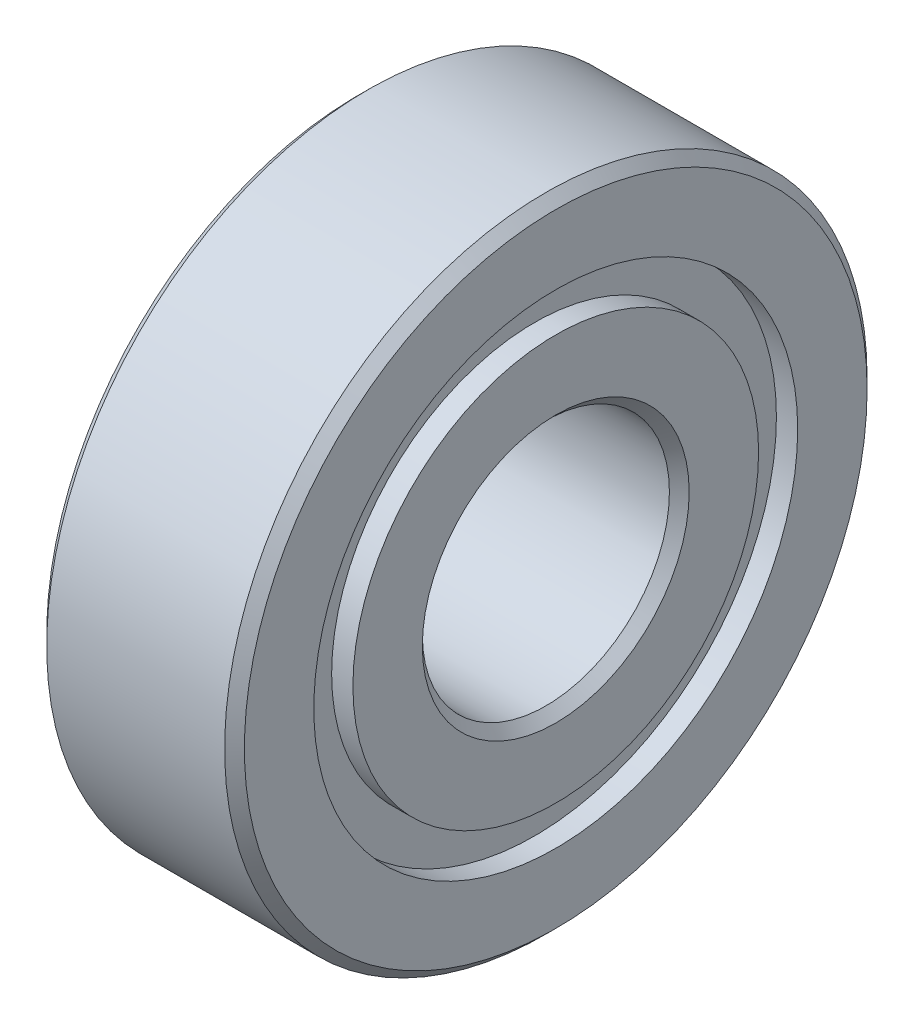
ISO-10303-21;
HEADER;
FILE_DESCRIPTION(('STEP AP214'),'2;1');
FILE_NAME('part.step','',(''),(''),'','','');
FILE_SCHEMA(('AUTOMOTIVE_DESIGN { 1 0 10303 214 1 1 1 1 }'));
ENDSEC;
DATA;
#1=APPLICATION_CONTEXT('core data for automotive mechanical design processes');
#2=APPLICATION_PROTOCOL_DEFINITION('international standard','automotive_design',2000,#1);
#3=PRODUCT_CONTEXT('',#1,'mechanical');
#4=PRODUCT('Part','Part','',(#3));
#5=PRODUCT_RELATED_PRODUCT_CATEGORY('part','',(#4));
#6=PRODUCT_DEFINITION_FORMATION('','',#4);
#7=PRODUCT_DEFINITION_CONTEXT('part definition',#1,'design');
#8=PRODUCT_DEFINITION('design','',#6,#7);
#9=PRODUCT_DEFINITION_SHAPE('','',#8);
#10=(LENGTH_UNIT() NAMED_UNIT(*) SI_UNIT(.MILLI.,.METRE.));
#11=(NAMED_UNIT(*) PLANE_ANGLE_UNIT() SI_UNIT($,.RADIAN.));
#12=(NAMED_UNIT(*) SI_UNIT($,.STERADIAN.) SOLID_ANGLE_UNIT());
#13=UNCERTAINTY_MEASURE_WITH_UNIT(LENGTH_MEASURE(1.E-05),#10,'distance_accuracy_value','');
#14=(GEOMETRIC_REPRESENTATION_CONTEXT(3) GLOBAL_UNCERTAINTY_ASSIGNED_CONTEXT((#13)) GLOBAL_UNIT_ASSIGNED_CONTEXT((#10,
#11,#12)) REPRESENTATION_CONTEXT('',''));
#15=CARTESIAN_POINT('',(0.,0.,0.));
#16=DIRECTION('',(0.,0.,1.));
#17=DIRECTION('',(1.,0.,0.));
#18=AXIS2_PLACEMENT_3D('',#15,#16,#17);
#19=CARTESIAN_POINT('',(4.,9.79120879120879,0.));
#20=DIRECTION('',(1.,0.,0.));
#21=DIRECTION('',(0.,0.,-1.));
#22=AXIS2_PLACEMENT_3D('',#19,#20,#21);
#23=PLANE('',#22);
#24=CARTESIAN_POINT('',(4.,0.,0.));
#25=DIRECTION('',(1.,0.,0.));
#26=DIRECTION('',(0.,0.,-1.));
#27=AXIS2_PLACEMENT_3D('',#24,#25,#26);
#28=CIRCLE('',#27,12.6);
#29=CARTESIAN_POINT('',(4.,0.,-12.6));
#30=VERTEX_POINT('',#29);
#31=EDGE_CURVE('E10',#30,#30,#28,.T.);
#32=ORIENTED_EDGE('',*,*,#31,.T.);
#33=EDGE_LOOP('',(#32));
#34=FACE_BOUND('',#33,.T.);
#35=CARTESIAN_POINT('',(4.,0.,0.));
#36=DIRECTION('',(1.,0.,0.));
#37=DIRECTION('',(0.,0.,-1.));
#38=AXIS2_PLACEMENT_3D('',#35,#36,#37);
#39=CIRCLE('',#38,9.79120879120879);
#40=CARTESIAN_POINT('',(4.,0.,-9.79120879120879));
#41=VERTEX_POINT('',#40);
#42=EDGE_CURVE('E88',#41,#41,#39,.T.);
#43=ORIENTED_EDGE('',*,*,#42,.F.);
#44=EDGE_LOOP('',(#43));
#45=FACE_BOUND('',#44,.T.);
#46=ADVANCED_FACE('F36',(#34,#45),#23,.T.);
#47=CARTESIAN_POINT('',(4.,0.,0.));
#48=DIRECTION('',(-1.,0.,0.));
#49=DIRECTION('',(0.,0.,1.));
#50=AXIS2_PLACEMENT_3D('',#47,#48,#49);
#51=CONICAL_SURFACE('',#50,12.6,0.78539816339745);
#52=CARTESIAN_POINT('',(3.6,0.,0.));
#53=DIRECTION('',(1.,0.,0.));
#54=DIRECTION('',(0.,0.,-1.));
#55=AXIS2_PLACEMENT_3D('',#52,#53,#54);
#56=CIRCLE('',#55,13.);
#57=CARTESIAN_POINT('',(3.6,0.,-13.));
#58=VERTEX_POINT('',#57);
#59=EDGE_CURVE('E42',#58,#58,#56,.T.);
#60=ORIENTED_EDGE('',*,*,#59,.T.);
#61=EDGE_LOOP('',(#60));
#62=FACE_BOUND('',#61,.T.);
#63=ORIENTED_EDGE('',*,*,#31,.F.);
#64=EDGE_LOOP('',(#63));
#65=FACE_BOUND('',#64,.T.);
#66=ADVANCED_FACE('F96',(#62,#65),#51,.T.);
#67=CARTESIAN_POINT('',(-4.,0.,0.));
#68=DIRECTION('',(1.,0.,0.));
#69=DIRECTION('',(0.,0.,-1.));
#70=AXIS2_PLACEMENT_3D('',#67,#68,#69);
#71=CYLINDRICAL_SURFACE('',#70,13.);
#72=CARTESIAN_POINT('',(-3.6,0.,0.));
#73=DIRECTION('',(1.,0.,0.));
#74=DIRECTION('',(0.,0.,-1.));
#75=AXIS2_PLACEMENT_3D('',#72,#73,#74);
#76=CIRCLE('',#75,13.);
#77=CARTESIAN_POINT('',(-3.6,0.,-13.));
#78=VERTEX_POINT('',#77);
#79=EDGE_CURVE('E46',#78,#78,#76,.T.);
#80=ORIENTED_EDGE('',*,*,#79,.T.);
#81=EDGE_LOOP('',(#80));
#82=FACE_BOUND('',#81,.T.);
#83=ORIENTED_EDGE('',*,*,#59,.F.);
#84=EDGE_LOOP('',(#83));
#85=FACE_BOUND('',#84,.T.);
#86=ADVANCED_FACE('F100',(#82,#85),#71,.T.);
#87=CARTESIAN_POINT('',(-3.6,0.,0.));
#88=DIRECTION('',(1.,0.,0.));
#89=DIRECTION('',(0.,0.,-1.));
#90=AXIS2_PLACEMENT_3D('',#87,#88,#89);
#91=CONICAL_SURFACE('',#90,13.,0.785398163397448);
#92=CARTESIAN_POINT('',(-4.,0.,0.));
#93=DIRECTION('',(1.,0.,0.));
#94=DIRECTION('',(0.,0.,-1.));
#95=AXIS2_PLACEMENT_3D('',#92,#93,#94);
#96=CIRCLE('',#95,12.6);
#97=CARTESIAN_POINT('',(-4.,0.,-12.6));
#98=VERTEX_POINT('',#97);
#99=EDGE_CURVE('E50',#98,#98,#96,.T.);
#100=ORIENTED_EDGE('',*,*,#99,.T.);
#101=EDGE_LOOP('',(#100));
#102=FACE_BOUND('',#101,.T.);
#103=ORIENTED_EDGE('',*,*,#79,.F.);
#104=EDGE_LOOP('',(#103));
#105=FACE_BOUND('',#104,.T.);
#106=ADVANCED_FACE('F104',(#102,#105),#91,.T.);
#107=CARTESIAN_POINT('',(-4.,12.6,0.));
#108=DIRECTION('',(-1.,0.,0.));
#109=DIRECTION('',(0.,0.,1.));
#110=AXIS2_PLACEMENT_3D('',#107,#108,#109);
#111=PLANE('',#110);
#112=CARTESIAN_POINT('',(-4.,0.,0.));
#113=DIRECTION('',(1.,0.,0.));
#114=DIRECTION('',(0.,0.,-1.));
#115=AXIS2_PLACEMENT_3D('',#112,#113,#114);
#116=CIRCLE('',#115,9.79120879120879);
#117=CARTESIAN_POINT('',(-4.,0.,-9.79120879120879));
#118=VERTEX_POINT('',#117);
#119=EDGE_CURVE('E55',#118,#118,#116,.T.);
#120=ORIENTED_EDGE('',*,*,#119,.T.);
#121=EDGE_LOOP('',(#120));
#122=FACE_BOUND('',#121,.T.);
#123=ORIENTED_EDGE('',*,*,#99,.F.);
#124=EDGE_LOOP('',(#123));
#125=FACE_BOUND('',#124,.T.);
#126=ADVANCED_FACE('F111',(#122,#125),#111,.T.);
#127=CARTESIAN_POINT('',(-4.,0.,0.));
#128=DIRECTION('',(1.,0.,0.));
#129=DIRECTION('',(0.,0.,-1.));
#130=AXIS2_PLACEMENT_3D('',#127,#128,#129);
#131=CYLINDRICAL_SURFACE('',#130,9.79120879120879);
#132=CARTESIAN_POINT('',(-3.13888889,0.,0.));
#133=DIRECTION('',(1.,0.,0.));
#134=DIRECTION('',(0.,0.,-1.));
#135=AXIS2_PLACEMENT_3D('',#132,#133,#134);
#136=CIRCLE('',#135,9.79120879120879);
#137=CARTESIAN_POINT('',(-3.13888889,0.,-9.79120879120879));
#138=VERTEX_POINT('',#137);
#139=EDGE_CURVE('E58',#138,#138,#136,.T.);
#140=ORIENTED_EDGE('',*,*,#139,.T.);
#141=EDGE_LOOP('',(#140));
#142=FACE_BOUND('',#141,.T.);
#143=ORIENTED_EDGE('',*,*,#119,.F.);
#144=EDGE_LOOP('',(#143));
#145=FACE_BOUND('',#144,.T.);
#146=ADVANCED_FACE('F115',(#142,#145),#131,.F.);
#147=CARTESIAN_POINT('',(-3.13888889,9.79120879120879,0.));
#148=DIRECTION('',(-1.,0.,0.));
#149=DIRECTION('',(0.,0.,1.));
#150=AXIS2_PLACEMENT_3D('',#147,#148,#149);
#151=PLANE('',#150);
#152=CARTESIAN_POINT('',(-3.13888889,0.,0.));
#153=DIRECTION('',(1.,0.,0.));
#154=DIRECTION('',(0.,0.,-1.));
#155=AXIS2_PLACEMENT_3D('',#152,#153,#154);
#156=CIRCLE('',#155,8.20879120879121);
#157=CARTESIAN_POINT('',(-3.13888889,0.,-8.20879120879121));
#158=VERTEX_POINT('',#157);
#159=EDGE_CURVE('E61',#158,#158,#156,.T.);
#160=ORIENTED_EDGE('',*,*,#159,.T.);
#161=EDGE_LOOP('',(#160));
#162=FACE_BOUND('',#161,.T.);
#163=ORIENTED_EDGE('',*,*,#139,.F.);
#164=EDGE_LOOP('',(#163));
#165=FACE_BOUND('',#164,.T.);
#166=ADVANCED_FACE('F119',(#162,#165),#151,.T.);
#167=CARTESIAN_POINT('',(-4.,0.,0.));
#168=DIRECTION('',(1.,0.,0.));
#169=DIRECTION('',(0.,0.,-1.));
#170=AXIS2_PLACEMENT_3D('',#167,#168,#169);
#171=CYLINDRICAL_SURFACE('',#170,8.20879120879121);
#172=CARTESIAN_POINT('',(-4.,0.,0.));
#173=DIRECTION('',(1.,0.,0.));
#174=DIRECTION('',(0.,0.,-1.));
#175=AXIS2_PLACEMENT_3D('',#172,#173,#174);
#176=CIRCLE('',#175,8.20879120879121);
#177=CARTESIAN_POINT('',(-4.,0.,-8.20879120879121));
#178=VERTEX_POINT('',#177);
#179=EDGE_CURVE('E64',#178,#178,#176,.T.);
#180=ORIENTED_EDGE('',*,*,#179,.T.);
#181=EDGE_LOOP('',(#180));
#182=FACE_BOUND('',#181,.T.);
#183=ORIENTED_EDGE('',*,*,#159,.F.);
#184=EDGE_LOOP('',(#183));
#185=FACE_BOUND('',#184,.T.);
#186=ADVANCED_FACE('F123',(#182,#185),#171,.T.);
#187=CARTESIAN_POINT('',(-4.,8.20879120879121,0.));
#188=DIRECTION('',(-1.,0.,0.));
#189=DIRECTION('',(0.,0.,1.));
#190=AXIS2_PLACEMENT_3D('',#187,#188,#189);
#191=PLANE('',#190);
#192=CARTESIAN_POINT('',(-4.,0.,0.));
#193=DIRECTION('',(1.,0.,0.));
#194=DIRECTION('',(0.,0.,-1.));
#195=AXIS2_PLACEMENT_3D('',#192,#193,#194);
#196=CIRCLE('',#195,5.40000000000001);
#197=CARTESIAN_POINT('',(-4.,0.,-5.40000000000001));
#198=VERTEX_POINT('',#197);
#199=EDGE_CURVE('E67',#198,#198,#196,.T.);
#200=ORIENTED_EDGE('',*,*,#199,.T.);
#201=EDGE_LOOP('',(#200));
#202=FACE_BOUND('',#201,.T.);
#203=ORIENTED_EDGE('',*,*,#179,.F.);
#204=EDGE_LOOP('',(#203));
#205=FACE_BOUND('',#204,.T.);
#206=ADVANCED_FACE('F127',(#202,#205),#191,.T.);
#207=CARTESIAN_POINT('',(-4.,0.,0.));
#208=DIRECTION('',(-1.,0.,0.));
#209=DIRECTION('',(0.,0.,1.));
#210=AXIS2_PLACEMENT_3D('',#207,#208,#209);
#211=CONICAL_SURFACE('',#210,5.40000000000001,0.785398163397448);
#212=CARTESIAN_POINT('',(-3.59999999999999,0.,0.));
#213=DIRECTION('',(1.,0.,0.));
#214=DIRECTION('',(0.,0.,-1.));
#215=AXIS2_PLACEMENT_3D('',#212,#213,#214);
#216=CIRCLE('',#215,5.);
#217=CARTESIAN_POINT('',(-3.59999999999999,0.,-5.));
#218=VERTEX_POINT('',#217);
#219=EDGE_CURVE('E70',#218,#218,#216,.T.);
#220=ORIENTED_EDGE('',*,*,#219,.T.);
#221=EDGE_LOOP('',(#220));
#222=FACE_BOUND('',#221,.T.);
#223=ORIENTED_EDGE('',*,*,#199,.F.);
#224=EDGE_LOOP('',(#223));
#225=FACE_BOUND('',#224,.T.);
#226=ADVANCED_FACE('F131',(#222,#225),#211,.F.);
#227=CARTESIAN_POINT('',(-4.,0.,0.));
#228=DIRECTION('',(1.,0.,0.));
#229=DIRECTION('',(0.,0.,-1.));
#230=AXIS2_PLACEMENT_3D('',#227,#228,#229);
#231=CYLINDRICAL_SURFACE('',#230,5.);
#232=CARTESIAN_POINT('',(3.6,0.,0.));
#233=DIRECTION('',(1.,0.,0.));
#234=DIRECTION('',(0.,0.,-1.));
#235=AXIS2_PLACEMENT_3D('',#232,#233,#234);
#236=CIRCLE('',#235,5.);
#237=CARTESIAN_POINT('',(3.6,0.,-5.));
#238=VERTEX_POINT('',#237);
#239=EDGE_CURVE('E73',#238,#238,#236,.T.);
#240=ORIENTED_EDGE('',*,*,#239,.T.);
#241=EDGE_LOOP('',(#240));
#242=FACE_BOUND('',#241,.T.);
#243=ORIENTED_EDGE('',*,*,#219,.F.);
#244=EDGE_LOOP('',(#243));
#245=FACE_BOUND('',#244,.T.);
#246=ADVANCED_FACE('F135',(#242,#245),#231,.F.);
#247=CARTESIAN_POINT('',(3.6,0.,0.));
#248=DIRECTION('',(1.,0.,0.));
#249=DIRECTION('',(0.,0.,-1.));
#250=AXIS2_PLACEMENT_3D('',#247,#248,#249);
#251=CONICAL_SURFACE('',#250,5.,0.785398163397448);
#252=CARTESIAN_POINT('',(4.,0.,0.));
#253=DIRECTION('',(1.,0.,0.));
#254=DIRECTION('',(0.,0.,-1.));
#255=AXIS2_PLACEMENT_3D('',#252,#253,#254);
#256=CIRCLE('',#255,5.4);
#257=CARTESIAN_POINT('',(4.,0.,-5.4));
#258=VERTEX_POINT('',#257);
#259=EDGE_CURVE('E76',#258,#258,#256,.T.);
#260=ORIENTED_EDGE('',*,*,#259,.T.);
#261=EDGE_LOOP('',(#260));
#262=FACE_BOUND('',#261,.T.);
#263=ORIENTED_EDGE('',*,*,#239,.F.);
#264=EDGE_LOOP('',(#263));
#265=FACE_BOUND('',#264,.T.);
#266=ADVANCED_FACE('F139',(#262,#265),#251,.F.);
#267=CARTESIAN_POINT('',(4.,5.4,0.));
#268=DIRECTION('',(1.,0.,0.));
#269=DIRECTION('',(0.,0.,-1.));
#270=AXIS2_PLACEMENT_3D('',#267,#268,#269);
#271=PLANE('',#270);
#272=CARTESIAN_POINT('',(4.,0.,0.));
#273=DIRECTION('',(1.,0.,0.));
#274=DIRECTION('',(0.,0.,-1.));
#275=AXIS2_PLACEMENT_3D('',#272,#273,#274);
#276=CIRCLE('',#275,8.20879120879121);
#277=CARTESIAN_POINT('',(4.,0.,-8.20879120879121));
#278=VERTEX_POINT('',#277);
#279=EDGE_CURVE('E79',#278,#278,#276,.T.);
#280=ORIENTED_EDGE('',*,*,#279,.T.);
#281=EDGE_LOOP('',(#280));
#282=FACE_BOUND('',#281,.T.);
#283=ORIENTED_EDGE('',*,*,#259,.F.);
#284=EDGE_LOOP('',(#283));
#285=FACE_BOUND('',#284,.T.);
#286=ADVANCED_FACE('F143',(#282,#285),#271,.T.);
#287=CARTESIAN_POINT('',(-4.,0.,0.));
#288=DIRECTION('',(1.,0.,0.));
#289=DIRECTION('',(0.,0.,-1.));
#290=AXIS2_PLACEMENT_3D('',#287,#288,#289);
#291=CYLINDRICAL_SURFACE('',#290,8.20879120879121);
#292=CARTESIAN_POINT('',(3.13888889,0.,0.));
#293=DIRECTION('',(1.,0.,0.));
#294=DIRECTION('',(0.,0.,-1.));
#295=AXIS2_PLACEMENT_3D('',#292,#293,#294);
#296=CIRCLE('',#295,8.20879120879121);
#297=CARTESIAN_POINT('',(3.13888889,0.,-8.20879120879121));
#298=VERTEX_POINT('',#297);
#299=EDGE_CURVE('E82',#298,#298,#296,.T.);
#300=ORIENTED_EDGE('',*,*,#299,.T.);
#301=EDGE_LOOP('',(#300));
#302=FACE_BOUND('',#301,.T.);
#303=ORIENTED_EDGE('',*,*,#279,.F.);
#304=EDGE_LOOP('',(#303));
#305=FACE_BOUND('',#304,.T.);
#306=ADVANCED_FACE('F147',(#302,#305),#291,.T.);
#307=CARTESIAN_POINT('',(3.13888889,8.20879120879121,0.));
#308=DIRECTION('',(1.,0.,0.));
#309=DIRECTION('',(0.,0.,-1.));
#310=AXIS2_PLACEMENT_3D('',#307,#308,#309);
#311=PLANE('',#310);
#312=CARTESIAN_POINT('',(3.13888889,0.,0.));
#313=DIRECTION('',(1.,0.,0.));
#314=DIRECTION('',(0.,0.,-1.));
#315=AXIS2_PLACEMENT_3D('',#312,#313,#314);
#316=CIRCLE('',#315,9.79120879120879);
#317=CARTESIAN_POINT('',(3.13888889,0.,-9.79120879120879));
#318=VERTEX_POINT('',#317);
#319=EDGE_CURVE('E85',#318,#318,#316,.T.);
#320=ORIENTED_EDGE('',*,*,#319,.T.);
#321=EDGE_LOOP('',(#320));
#322=FACE_BOUND('',#321,.T.);
#323=ORIENTED_EDGE('',*,*,#299,.F.);
#324=EDGE_LOOP('',(#323));
#325=FACE_BOUND('',#324,.T.);
#326=ADVANCED_FACE('F151',(#322,#325),#311,.T.);
#327=CARTESIAN_POINT('',(-4.,0.,0.));
#328=DIRECTION('',(1.,0.,0.));
#329=DIRECTION('',(0.,0.,-1.));
#330=AXIS2_PLACEMENT_3D('',#327,#328,#329);
#331=CYLINDRICAL_SURFACE('',#330,9.79120879120879);
#332=ORIENTED_EDGE('',*,*,#42,.T.);
#333=EDGE_LOOP('',(#332));
#334=FACE_BOUND('',#333,.T.);
#335=ORIENTED_EDGE('',*,*,#319,.F.);
#336=EDGE_LOOP('',(#335));
#337=FACE_BOUND('',#336,.T.);
#338=ADVANCED_FACE('F92',(#334,#337),#331,.F.);
#339=CLOSED_SHELL('',(#46,#66,#86,#106,#126,#146,#166,#186,#206,#226,#246,#266,#286,#306,#326,#338));
#340=MANIFOLD_SOLID_BREP('B2',#339);
#341=ADVANCED_BREP_SHAPE_REPRESENTATION('',(#18,#340),#14);
#342=SHAPE_DEFINITION_REPRESENTATION(#9,#341);
ENDSEC;
END-ISO-10303-21;
